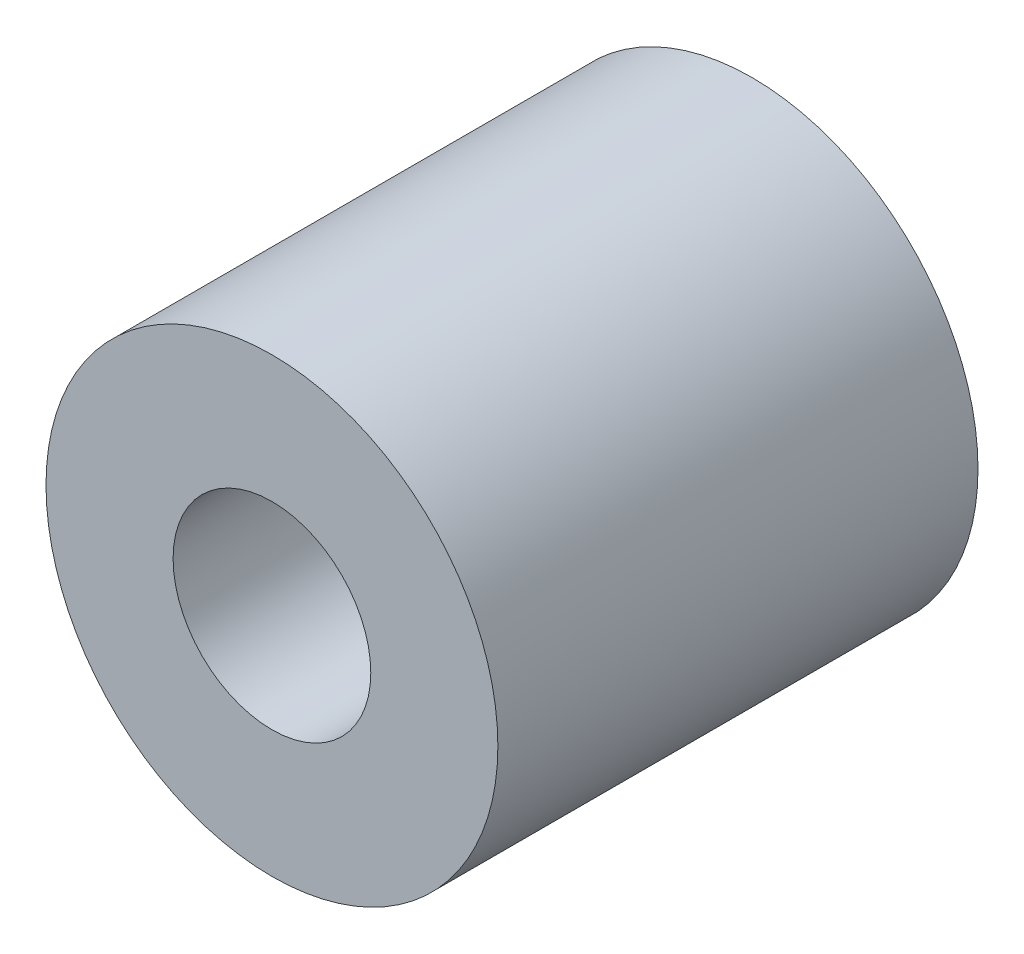
ISO-10303-21;
HEADER;
FILE_DESCRIPTION(('STEP AP214'),'2;1');
FILE_NAME('part.step','',(''),(''),'','','');
FILE_SCHEMA(('AUTOMOTIVE_DESIGN { 1 0 10303 214 1 1 1 1 }'));
ENDSEC;
DATA;
#1=APPLICATION_CONTEXT('core data for automotive mechanical design processes');
#2=APPLICATION_PROTOCOL_DEFINITION('international standard','automotive_design',2000,#1);
#3=PRODUCT_CONTEXT('',#1,'mechanical');
#4=PRODUCT('Part','Part','',(#3));
#5=PRODUCT_RELATED_PRODUCT_CATEGORY('part','',(#4));
#6=PRODUCT_DEFINITION_FORMATION('','',#4);
#7=PRODUCT_DEFINITION_CONTEXT('part definition',#1,'design');
#8=PRODUCT_DEFINITION('design','',#6,#7);
#9=PRODUCT_DEFINITION_SHAPE('','',#8);
#10=(LENGTH_UNIT() NAMED_UNIT(*) SI_UNIT(.MILLI.,.METRE.));
#11=(NAMED_UNIT(*) PLANE_ANGLE_UNIT() SI_UNIT($,.RADIAN.));
#12=(NAMED_UNIT(*) SI_UNIT($,.STERADIAN.) SOLID_ANGLE_UNIT());
#13=UNCERTAINTY_MEASURE_WITH_UNIT(LENGTH_MEASURE(1.E-05),#10,'distance_accuracy_value','');
#14=(GEOMETRIC_REPRESENTATION_CONTEXT(3) GLOBAL_UNCERTAINTY_ASSIGNED_CONTEXT((#13)) GLOBAL_UNIT_ASSIGNED_CONTEXT((#10,
#11,#12)) REPRESENTATION_CONTEXT('',''));
#15=CARTESIAN_POINT('',(0.,0.,0.));
#16=DIRECTION('',(0.,0.,1.));
#17=DIRECTION('',(1.,0.,0.));
#18=AXIS2_PLACEMENT_3D('',#15,#16,#17);
#19=CARTESIAN_POINT('',(0.,0.,8.5));
#20=DIRECTION('',(0.,0.,1.));
#21=DIRECTION('',(1.,0.,0.));
#22=AXIS2_PLACEMENT_3D('',#19,#20,#21);
#23=PLANE('',#22);
#24=CARTESIAN_POINT('',(0.,0.,8.5));
#25=DIRECTION('',(0.,0.,1.));
#26=DIRECTION('',(1.,0.,0.));
#27=AXIS2_PLACEMENT_3D('',#24,#25,#26);
#28=CIRCLE('',#27,4.);
#29=CARTESIAN_POINT('',(4.,0.,8.5));
#30=VERTEX_POINT('',#29);
#31=EDGE_CURVE('E10',#30,#30,#28,.T.);
#32=ORIENTED_EDGE('',*,*,#31,.T.);
#33=EDGE_LOOP('',(#32));
#34=FACE_BOUND('',#33,.T.);
#35=CARTESIAN_POINT('',(0.,0.,8.5));
#36=DIRECTION('',(0.,0.,1.));
#37=DIRECTION('',(1.,0.,0.));
#38=AXIS2_PLACEMENT_3D('',#35,#36,#37);
#39=CIRCLE('',#38,1.75);
#40=CARTESIAN_POINT('',(1.75,0.,8.5));
#41=VERTEX_POINT('',#40);
#42=EDGE_CURVE('E53',#41,#41,#39,.T.);
#43=ORIENTED_EDGE('',*,*,#42,.F.);
#44=EDGE_LOOP('',(#43));
#45=FACE_BOUND('',#44,.T.);
#46=ADVANCED_FACE('F40',(#34,#45),#23,.T.);
#47=CARTESIAN_POINT('',(0.,0.,0.));
#48=DIRECTION('',(0.,0.,1.));
#49=DIRECTION('',(1.,0.,0.));
#50=AXIS2_PLACEMENT_3D('',#47,#48,#49);
#51=PLANE('',#50);
#52=CARTESIAN_POINT('',(0.,0.,0.));
#53=DIRECTION('',(0.,0.,1.));
#54=DIRECTION('',(1.,0.,0.));
#55=AXIS2_PLACEMENT_3D('',#52,#53,#54);
#56=CIRCLE('',#55,4.);
#57=CARTESIAN_POINT('',(4.,0.,0.));
#58=VERTEX_POINT('',#57);
#59=EDGE_CURVE('E44',#58,#58,#56,.T.);
#60=ORIENTED_EDGE('',*,*,#59,.F.);
#61=EDGE_LOOP('',(#60));
#62=FACE_BOUND('',#61,.T.);
#63=CARTESIAN_POINT('',(0.,0.,0.));
#64=DIRECTION('',(0.,0.,1.));
#65=DIRECTION('',(1.,0.,0.));
#66=AXIS2_PLACEMENT_3D('',#63,#64,#65);
#67=CIRCLE('',#66,1.75);
#68=CARTESIAN_POINT('',(1.75,0.,0.));
#69=VERTEX_POINT('',#68);
#70=EDGE_CURVE('E55',#69,#69,#67,.T.);
#71=ORIENTED_EDGE('',*,*,#70,.T.);
#72=EDGE_LOOP('',(#71));
#73=FACE_BOUND('',#72,.T.);
#74=ADVANCED_FACE('F67',(#62,#73),#51,.F.);
#75=CARTESIAN_POINT('',(0.,0.,8.5));
#76=DIRECTION('',(0.,0.,-1.));
#77=DIRECTION('',(-1.,0.,0.));
#78=AXIS2_PLACEMENT_3D('',#75,#76,#77);
#79=CYLINDRICAL_SURFACE('',#78,4.);
#80=ORIENTED_EDGE('',*,*,#31,.F.);
#81=EDGE_LOOP('',(#80));
#82=FACE_BOUND('',#81,.T.);
#83=ORIENTED_EDGE('',*,*,#59,.T.);
#84=EDGE_LOOP('',(#83));
#85=FACE_BOUND('',#84,.T.);
#86=ADVANCED_FACE('F42',(#82,#85),#79,.T.);
#87=CARTESIAN_POINT('',(0.,0.,8.5));
#88=DIRECTION('',(0.,0.,-1.));
#89=DIRECTION('',(-1.,0.,0.));
#90=AXIS2_PLACEMENT_3D('',#87,#88,#89);
#91=CYLINDRICAL_SURFACE('',#90,1.75);
#92=ORIENTED_EDGE('',*,*,#42,.T.);
#93=EDGE_LOOP('',(#92));
#94=FACE_BOUND('',#93,.T.);
#95=ORIENTED_EDGE('',*,*,#70,.F.);
#96=EDGE_LOOP('',(#95));
#97=FACE_BOUND('',#96,.T.);
#98=ADVANCED_FACE('F63',(#94,#97),#91,.F.);
#99=CLOSED_SHELL('',(#46,#74,#86,#98));
#100=MANIFOLD_SOLID_BREP('B2',#99);
#101=ADVANCED_BREP_SHAPE_REPRESENTATION('',(#18,#100),#14);
#102=SHAPE_DEFINITION_REPRESENTATION(#9,#101);
ENDSEC;
END-ISO-10303-21;
